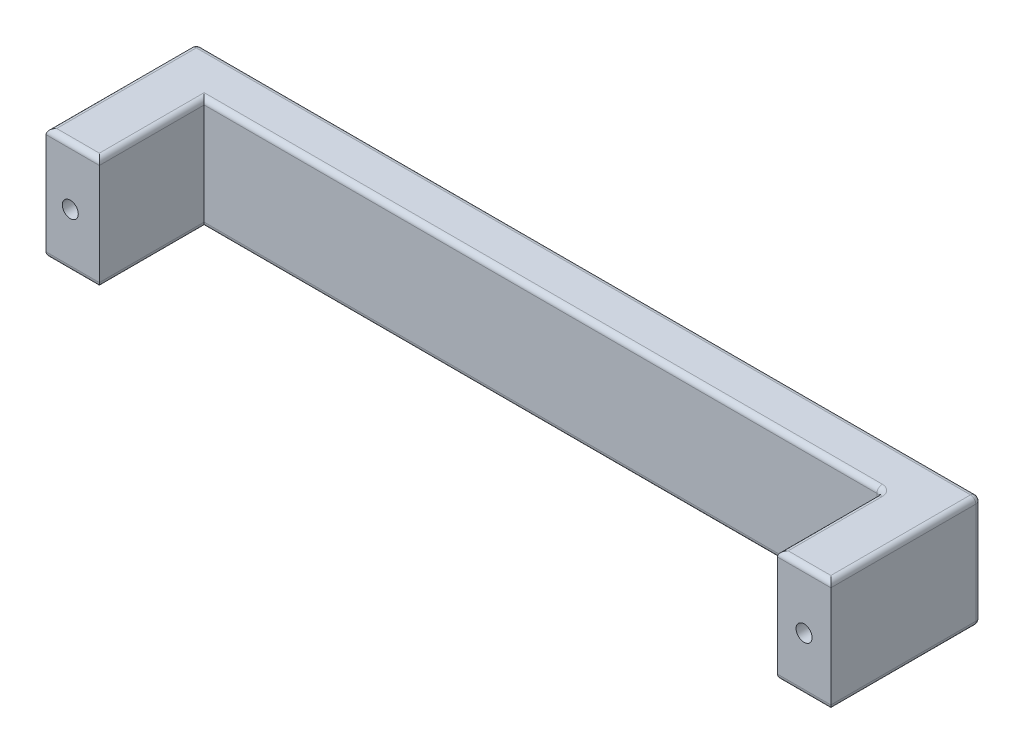
ISO-10303-21;
HEADER;
FILE_DESCRIPTION(('STEP AP214'),'2;1');
FILE_NAME('part.step','',(''),(''),'','','');
FILE_SCHEMA(('AUTOMOTIVE_DESIGN { 1 0 10303 214 1 1 1 1 }'));
ENDSEC;
DATA;
#1=APPLICATION_CONTEXT('core data for automotive mechanical design processes');
#2=APPLICATION_PROTOCOL_DEFINITION('international standard','automotive_design',2000,#1);
#3=PRODUCT_CONTEXT('',#1,'mechanical');
#4=PRODUCT('Part','Part','',(#3));
#5=PRODUCT_RELATED_PRODUCT_CATEGORY('part','',(#4));
#6=PRODUCT_DEFINITION_FORMATION('','',#4);
#7=PRODUCT_DEFINITION_CONTEXT('part definition',#1,'design');
#8=PRODUCT_DEFINITION('design','',#6,#7);
#9=PRODUCT_DEFINITION_SHAPE('','',#8);
#10=(LENGTH_UNIT() NAMED_UNIT(*) SI_UNIT(.MILLI.,.METRE.));
#11=(NAMED_UNIT(*) PLANE_ANGLE_UNIT() SI_UNIT($,.RADIAN.));
#12=(NAMED_UNIT(*) SI_UNIT($,.STERADIAN.) SOLID_ANGLE_UNIT());
#13=UNCERTAINTY_MEASURE_WITH_UNIT(LENGTH_MEASURE(1.E-05),#10,'distance_accuracy_value','');
#14=(GEOMETRIC_REPRESENTATION_CONTEXT(3) GLOBAL_UNCERTAINTY_ASSIGNED_CONTEXT((#13)) GLOBAL_UNIT_ASSIGNED_CONTEXT((#10,
#11,#12)) REPRESENTATION_CONTEXT('',''));
#15=CARTESIAN_POINT('',(0.,0.,0.));
#16=DIRECTION('',(0.,0.,1.));
#17=DIRECTION('',(1.,0.,0.));
#18=AXIS2_PLACEMENT_3D('',#15,#16,#17);
#19=CARTESIAN_POINT('',(-35.5555555555556,21.,0.));
#20=DIRECTION('',(0.,0.,-1.));
#21=DIRECTION('',(-1.,0.,0.));
#22=AXIS2_PLACEMENT_3D('',#19,#20,#21);
#23=PLANE('',#22);
#24=CARTESIAN_POINT('',(-41.007352784606,10.1448786083689,0.));
#25=DIRECTION('',(0.,0.,1.));
#26=DIRECTION('',(1.,0.,0.));
#27=AXIS2_PLACEMENT_3D('',#24,#25,#26);
#28=CIRCLE('',#27,1.5);
#29=CARTESIAN_POINT('',(-39.507352784606,10.1448786083689,0.));
#30=VERTEX_POINT('',#29);
#31=EDGE_CURVE('E184',#30,#30,#28,.T.);
#32=ORIENTED_EDGE('',*,*,#31,.F.);
#33=EDGE_LOOP('',(#32));
#34=FACE_BOUND('',#33,.T.);
#35=DIRECTION('',(0.,-1.,0.));
#36=VECTOR('',#35,1.);
#37=CARTESIAN_POINT('',(-45.5555555555555,21.,0.));
#38=LINE('',#37,#36);
#39=CARTESIAN_POINT('',(-45.5555555555555,20.,0.));
#40=VERTEX_POINT('',#39);
#41=CARTESIAN_POINT('',(-45.5555555555555,1.00000000000001,0.));
#42=VERTEX_POINT('',#41);
#43=EDGE_CURVE('E195',#40,#42,#38,.T.);
#44=ORIENTED_EDGE('',*,*,#43,.T.);
#45=DIRECTION('',(1.,0.,0.));
#46=VECTOR('',#45,1.);
#47=CARTESIAN_POINT('',(-35.5555555555556,1.,0.));
#48=LINE('',#47,#46);
#49=CARTESIAN_POINT('',(-35.5555555555556,1.00000000000001,0.));
#50=VERTEX_POINT('',#49);
#51=EDGE_CURVE('E271',#42,#50,#48,.T.);
#52=ORIENTED_EDGE('',*,*,#51,.T.);
#53=DIRECTION('',(0.,-1.,0.));
#54=VECTOR('',#53,1.);
#55=CARTESIAN_POINT('',(-35.5555555555556,21.,0.));
#56=LINE('',#55,#54);
#57=CARTESIAN_POINT('',(-35.5555555555556,20.,0.));
#58=VERTEX_POINT('',#57);
#59=EDGE_CURVE('E207',#58,#50,#56,.T.);
#60=ORIENTED_EDGE('',*,*,#59,.F.);
#61=DIRECTION('',(1.,0.,0.));
#62=VECTOR('',#61,1.);
#63=CARTESIAN_POINT('',(-35.5555555555556,20.,0.));
#64=LINE('',#63,#62);
#65=EDGE_CURVE('E269',#58,#40,#64,.F.);
#66=ORIENTED_EDGE('',*,*,#65,.T.);
#67=EDGE_LOOP('',(#44,#52,#60,#66));
#68=FACE_BOUND('',#67,.T.);
#69=ADVANCED_FACE('F34',(#34,#68),#23,.F.);
#70=CARTESIAN_POINT('',(-35.5555555555556,21.,-19.6296296296296));
#71=DIRECTION('',(-1.,0.,0.));
#72=DIRECTION('',(0.,0.,1.));
#73=AXIS2_PLACEMENT_3D('',#70,#71,#72);
#74=PLANE('',#73);
#75=ORIENTED_EDGE('',*,*,#59,.T.);
#76=DIRECTION('',(0.,0.,-1.));
#77=VECTOR('',#76,1.);
#78=CARTESIAN_POINT('',(-35.5555555555556,1.,-19.6296296296296));
#79=LINE('',#78,#77);
#80=CARTESIAN_POINT('',(-35.5555555555556,1.00000000000001,-19.6296296296296));
#81=VERTEX_POINT('',#80);
#82=EDGE_CURVE('E275',#50,#81,#79,.T.);
#83=ORIENTED_EDGE('',*,*,#82,.T.);
#84=DIRECTION('',(0.,-1.,0.));
#85=VECTOR('',#84,1.);
#86=CARTESIAN_POINT('',(-35.5555555555556,21.,-19.6296296296296));
#87=LINE('',#86,#85);
#88=CARTESIAN_POINT('',(-35.5555555555556,20.,-19.6296296296296));
#89=VERTEX_POINT('',#88);
#90=EDGE_CURVE('E204',#89,#81,#87,.T.);
#91=ORIENTED_EDGE('',*,*,#90,.F.);
#92=DIRECTION('',(0.,0.,-1.));
#93=VECTOR('',#92,1.);
#94=CARTESIAN_POINT('',(-35.5555555555556,20.,-19.6296296296296));
#95=LINE('',#94,#93);
#96=EDGE_CURVE('E273',#89,#58,#95,.F.);
#97=ORIENTED_EDGE('',*,*,#96,.T.);
#98=EDGE_LOOP('',(#75,#83,#91,#97));
#99=FACE_BOUND('',#98,.T.);
#100=ADVANCED_FACE('F431',(#99),#74,.F.);
#101=CARTESIAN_POINT('',(91.4814814814814,21.,-19.6296296296296));
#102=DIRECTION('',(0.,0.,-1.));
#103=DIRECTION('',(-1.,0.,0.));
#104=AXIS2_PLACEMENT_3D('',#101,#102,#103);
#105=PLANE('',#104);
#106=ORIENTED_EDGE('',*,*,#90,.T.);
#107=DIRECTION('',(1.,0.,0.));
#108=VECTOR('',#107,1.);
#109=CARTESIAN_POINT('',(91.4814814814814,1.,-19.6296296296296));
#110=LINE('',#109,#108);
#111=CARTESIAN_POINT('',(90.4814814814814,1.,-19.6296296296296));
#112=VERTEX_POINT('',#111);
#113=EDGE_CURVE('E263',#81,#112,#110,.T.);
#114=ORIENTED_EDGE('',*,*,#113,.T.);
#115=DIRECTION('',(0.,-1.,0.));
#116=VECTOR('',#115,1.);
#117=CARTESIAN_POINT('',(90.4814814814814,21.,-19.6296296296296));
#118=LINE('',#117,#116);
#119=CARTESIAN_POINT('',(90.4814814814814,20.,-19.6296296296296));
#120=VERTEX_POINT('',#119);
#121=EDGE_CURVE('E261',#112,#120,#118,.F.);
#122=ORIENTED_EDGE('',*,*,#121,.T.);
#123=DIRECTION('',(1.,0.,0.));
#124=VECTOR('',#123,1.);
#125=CARTESIAN_POINT('',(91.4814814814814,20.,-19.6296296296296));
#126=LINE('',#125,#124);
#127=EDGE_CURVE('E259',#120,#89,#126,.F.);
#128=ORIENTED_EDGE('',*,*,#127,.T.);
#129=EDGE_LOOP('',(#106,#114,#122,#128));
#130=FACE_BOUND('',#129,.T.);
#131=ADVANCED_FACE('F442',(#130),#105,.F.);
#132=CARTESIAN_POINT('',(91.4814814814814,21.,0.));
#133=DIRECTION('',(1.,0.,0.));
#134=DIRECTION('',(0.,0.,-1.));
#135=AXIS2_PLACEMENT_3D('',#132,#133,#134);
#136=PLANE('',#135);
#137=DIRECTION('',(0.,-1.,0.));
#138=VECTOR('',#137,1.);
#139=CARTESIAN_POINT('',(91.4814814814814,0.,-18.6296296296296));
#140=LINE('',#139,#138);
#141=CARTESIAN_POINT('',(91.4814814814814,20.,-18.6296296296296));
#142=VERTEX_POINT('',#141);
#143=CARTESIAN_POINT('',(91.4814814814814,1.,-18.6296296296296));
#144=VERTEX_POINT('',#143);
#145=EDGE_CURVE('E255',#142,#144,#140,.T.);
#146=ORIENTED_EDGE('',*,*,#145,.T.);
#147=DIRECTION('',(0.,0.,1.));
#148=VECTOR('',#147,1.);
#149=CARTESIAN_POINT('',(91.4814814814814,1.,0.));
#150=LINE('',#149,#148);
#151=CARTESIAN_POINT('',(91.4814814814814,1.00000000000001,0.));
#152=VERTEX_POINT('',#151);
#153=EDGE_CURVE('E257',#144,#152,#150,.T.);
#154=ORIENTED_EDGE('',*,*,#153,.T.);
#155=DIRECTION('',(0.,-1.,0.));
#156=VECTOR('',#155,1.);
#157=CARTESIAN_POINT('',(91.4814814814814,21.,0.));
#158=LINE('',#157,#156);
#159=CARTESIAN_POINT('',(91.4814814814814,20.,0.));
#160=VERTEX_POINT('',#159);
#161=EDGE_CURVE('E201',#160,#152,#158,.T.);
#162=ORIENTED_EDGE('',*,*,#161,.F.);
#163=DIRECTION('',(0.,0.,1.));
#164=VECTOR('',#163,1.);
#165=CARTESIAN_POINT('',(91.4814814814814,20.,0.));
#166=LINE('',#165,#164);
#167=EDGE_CURVE('E253',#160,#142,#166,.F.);
#168=ORIENTED_EDGE('',*,*,#167,.T.);
#169=EDGE_LOOP('',(#146,#154,#162,#168));
#170=FACE_BOUND('',#169,.T.);
#171=ADVANCED_FACE('F456',(#170),#136,.F.);
#172=CARTESIAN_POINT('',(101.481481481481,21.,0.));
#173=DIRECTION('',(0.,0.,-1.));
#174=DIRECTION('',(-1.,0.,0.));
#175=AXIS2_PLACEMENT_3D('',#172,#173,#174);
#176=PLANE('',#175);
#177=CARTESIAN_POINT('',(96.462672376075,10.1448786083689,0.));
#178=DIRECTION('',(0.,0.,1.));
#179=DIRECTION('',(1.,0.,0.));
#180=AXIS2_PLACEMENT_3D('',#177,#178,#179);
#181=CIRCLE('',#180,1.5);
#182=CARTESIAN_POINT('',(97.962672376075,10.1448786083689,0.));
#183=VERTEX_POINT('',#182);
#184=EDGE_CURVE('E183',#183,#183,#181,.T.);
#185=ORIENTED_EDGE('',*,*,#184,.F.);
#186=EDGE_LOOP('',(#185));
#187=FACE_BOUND('',#186,.T.);
#188=ORIENTED_EDGE('',*,*,#161,.T.);
#189=DIRECTION('',(1.,0.,0.));
#190=VECTOR('',#189,1.);
#191=CARTESIAN_POINT('',(101.481481481481,1.,0.));
#192=LINE('',#191,#190);
#193=CARTESIAN_POINT('',(101.481481481481,1.00000000000001,0.));
#194=VERTEX_POINT('',#193);
#195=EDGE_CURVE('E267',#152,#194,#192,.T.);
#196=ORIENTED_EDGE('',*,*,#195,.T.);
#197=DIRECTION('',(0.,-1.,0.));
#198=VECTOR('',#197,1.);
#199=CARTESIAN_POINT('',(101.481481481481,21.,0.));
#200=LINE('',#199,#198);
#201=CARTESIAN_POINT('',(101.481481481481,20.,0.));
#202=VERTEX_POINT('',#201);
#203=EDGE_CURVE('E198',#202,#194,#200,.T.);
#204=ORIENTED_EDGE('',*,*,#203,.F.);
#205=DIRECTION('',(1.,0.,0.));
#206=VECTOR('',#205,1.);
#207=CARTESIAN_POINT('',(101.481481481481,20.,0.));
#208=LINE('',#207,#206);
#209=EDGE_CURVE('E265',#202,#160,#208,.F.);
#210=ORIENTED_EDGE('',*,*,#209,.T.);
#211=EDGE_LOOP('',(#188,#196,#204,#210));
#212=FACE_BOUND('',#211,.T.);
#213=ADVANCED_FACE('F459',(#187,#212),#176,.F.);
#214=CARTESIAN_POINT('',(101.481481481481,21.,-28.1481481481481));
#215=DIRECTION('',(-1.,0.,0.));
#216=DIRECTION('',(0.,0.,1.));
#217=AXIS2_PLACEMENT_3D('',#214,#215,#216);
#218=PLANE('',#217);
#219=ORIENTED_EDGE('',*,*,#203,.T.);
#220=DIRECTION('',(0.,0.,-1.));
#221=VECTOR('',#220,1.);
#222=CARTESIAN_POINT('',(101.481481481481,1.,-28.1481481481481));
#223=LINE('',#222,#221);
#224=CARTESIAN_POINT('',(101.481481481481,1.,-27.1481481481481));
#225=VERTEX_POINT('',#224);
#226=EDGE_CURVE('E244',#194,#225,#223,.T.);
#227=ORIENTED_EDGE('',*,*,#226,.T.);
#228=DIRECTION('',(0.,-1.,0.));
#229=VECTOR('',#228,1.);
#230=CARTESIAN_POINT('',(101.481481481481,21.,-27.1481481481481));
#231=LINE('',#230,#229);
#232=CARTESIAN_POINT('',(101.481481481481,20.,-27.1481481481481));
#233=VERTEX_POINT('',#232);
#234=EDGE_CURVE('E241',#225,#233,#231,.F.);
#235=ORIENTED_EDGE('',*,*,#234,.T.);
#236=DIRECTION('',(0.,0.,-1.));
#237=VECTOR('',#236,1.);
#238=CARTESIAN_POINT('',(101.481481481481,20.,-28.1481481481481));
#239=LINE('',#238,#237);
#240=EDGE_CURVE('E239',#233,#202,#239,.F.);
#241=ORIENTED_EDGE('',*,*,#240,.T.);
#242=EDGE_LOOP('',(#219,#227,#235,#241));
#243=FACE_BOUND('',#242,.T.);
#244=ADVANCED_FACE('F577',(#243),#218,.F.);
#245=CARTESIAN_POINT('',(-45.5555555555555,21.,-28.1481481481481));
#246=DIRECTION('',(0.,0.,1.));
#247=DIRECTION('',(1.,0.,0.));
#248=AXIS2_PLACEMENT_3D('',#245,#246,#247);
#249=PLANE('',#248);
#250=DIRECTION('',(0.,-1.,0.));
#251=VECTOR('',#250,1.);
#252=CARTESIAN_POINT('',(100.481481481481,21.,-28.1481481481481));
#253=LINE('',#252,#251);
#254=CARTESIAN_POINT('',(100.481481481481,20.,-28.1481481481481));
#255=VERTEX_POINT('',#254);
#256=CARTESIAN_POINT('',(100.481481481481,1.,-28.1481481481481));
#257=VERTEX_POINT('',#256);
#258=EDGE_CURVE('E214',#255,#257,#253,.T.);
#259=ORIENTED_EDGE('',*,*,#258,.T.);
#260=DIRECTION('',(-1.,0.,0.));
#261=VECTOR('',#260,1.);
#262=CARTESIAN_POINT('',(-45.5555555555555,1.,-28.1481481481481));
#263=LINE('',#262,#261);
#264=CARTESIAN_POINT('',(-44.5555555555555,1.,-28.1481481481481));
#265=VERTEX_POINT('',#264);
#266=EDGE_CURVE('E216',#257,#265,#263,.T.);
#267=ORIENTED_EDGE('',*,*,#266,.T.);
#268=DIRECTION('',(0.,-1.,0.));
#269=VECTOR('',#268,1.);
#270=CARTESIAN_POINT('',(-44.5555555555555,21.,-28.1481481481481));
#271=LINE('',#270,#269);
#272=CARTESIAN_POINT('',(-44.5555555555555,20.,-28.1481481481481));
#273=VERTEX_POINT('',#272);
#274=EDGE_CURVE('E212',#265,#273,#271,.F.);
#275=ORIENTED_EDGE('',*,*,#274,.T.);
#276=DIRECTION('',(-1.,0.,0.));
#277=VECTOR('',#276,1.);
#278=CARTESIAN_POINT('',(-45.5555555555555,20.,-28.1481481481481));
#279=LINE('',#278,#277);
#280=EDGE_CURVE('E210',#273,#255,#279,.F.);
#281=ORIENTED_EDGE('',*,*,#280,.T.);
#282=EDGE_LOOP('',(#259,#267,#275,#281));
#283=FACE_BOUND('',#282,.T.);
#284=ADVANCED_FACE('F574',(#283),#249,.F.);
#285=CARTESIAN_POINT('',(-45.5555555555555,21.,0.));
#286=DIRECTION('',(1.,0.,0.));
#287=DIRECTION('',(0.,0.,-1.));
#288=AXIS2_PLACEMENT_3D('',#285,#286,#287);
#289=PLANE('',#288);
#290=DIRECTION('',(0.,-1.,0.));
#291=VECTOR('',#290,1.);
#292=CARTESIAN_POINT('',(-45.5555555555555,21.,-27.1481481481481));
#293=LINE('',#292,#291);
#294=CARTESIAN_POINT('',(-45.5555555555555,20.,-27.1481481481481));
#295=VERTEX_POINT('',#294);
#296=CARTESIAN_POINT('',(-45.5555555555555,1.,-27.1481481481481));
#297=VERTEX_POINT('',#296);
#298=EDGE_CURVE('E248',#295,#297,#293,.T.);
#299=ORIENTED_EDGE('',*,*,#298,.T.);
#300=DIRECTION('',(0.,0.,1.));
#301=VECTOR('',#300,1.);
#302=CARTESIAN_POINT('',(-45.5555555555555,1.,0.));
#303=LINE('',#302,#301);
#304=EDGE_CURVE('E250',#297,#42,#303,.T.);
#305=ORIENTED_EDGE('',*,*,#304,.T.);
#306=ORIENTED_EDGE('',*,*,#43,.F.);
#307=DIRECTION('',(0.,0.,1.));
#308=VECTOR('',#307,1.);
#309=CARTESIAN_POINT('',(-45.5555555555555,20.,0.));
#310=LINE('',#309,#308);
#311=EDGE_CURVE('E246',#40,#295,#310,.F.);
#312=ORIENTED_EDGE('',*,*,#311,.T.);
#313=EDGE_LOOP('',(#299,#305,#306,#312));
#314=FACE_BOUND('',#313,.T.);
#315=ADVANCED_FACE('F398',(#314),#289,.F.);
#316=CARTESIAN_POINT('',(0.,21.,0.));
#317=DIRECTION('',(0.,-1.,0.));
#318=DIRECTION('',(0.,0.,-1.));
#319=AXIS2_PLACEMENT_3D('',#316,#317,#318);
#320=PLANE('',#319);
#321=DIRECTION('',(0.,0.,1.));
#322=VECTOR('',#321,1.);
#323=CARTESIAN_POINT('',(92.4814814814814,21.,0.));
#324=LINE('',#323,#322);
#325=CARTESIAN_POINT('',(92.4814814814814,21.,-18.6296296296296));
#326=VERTEX_POINT('',#325);
#327=CARTESIAN_POINT('',(92.4814814814814,21.,-1.));
#328=VERTEX_POINT('',#327);
#329=EDGE_CURVE('E282',#326,#328,#324,.T.);
#330=ORIENTED_EDGE('',*,*,#329,.T.);
#331=DIRECTION('',(1.,0.,0.));
#332=VECTOR('',#331,1.);
#333=CARTESIAN_POINT('',(0.,21.,-1.));
#334=LINE('',#333,#332);
#335=CARTESIAN_POINT('',(100.481481481481,21.,-1.));
#336=VERTEX_POINT('',#335);
#337=EDGE_CURVE('E11',#328,#336,#334,.T.);
#338=ORIENTED_EDGE('',*,*,#337,.T.);
#339=DIRECTION('',(0.,0.,-1.));
#340=VECTOR('',#339,1.);
#341=CARTESIAN_POINT('',(100.481481481481,21.,0.));
#342=LINE('',#341,#340);
#343=CARTESIAN_POINT('',(100.481481481481,21.,-27.1481481481481));
#344=VERTEX_POINT('',#343);
#345=EDGE_CURVE('E43',#336,#344,#342,.T.);
#346=ORIENTED_EDGE('',*,*,#345,.T.);
#347=DIRECTION('',(-1.,0.,0.));
#348=VECTOR('',#347,1.);
#349=CARTESIAN_POINT('',(0.,21.,-27.1481481481481));
#350=LINE('',#349,#348);
#351=CARTESIAN_POINT('',(-44.5555555555555,21.,-27.1481481481481));
#352=VERTEX_POINT('',#351);
#353=EDGE_CURVE('E291',#344,#352,#350,.T.);
#354=ORIENTED_EDGE('',*,*,#353,.T.);
#355=DIRECTION('',(0.,0.,1.));
#356=VECTOR('',#355,1.);
#357=CARTESIAN_POINT('',(-44.5555555555555,21.,0.));
#358=LINE('',#357,#356);
#359=CARTESIAN_POINT('',(-44.5555555555555,21.,-1.));
#360=VERTEX_POINT('',#359);
#361=EDGE_CURVE('E289',#352,#360,#358,.T.);
#362=ORIENTED_EDGE('',*,*,#361,.T.);
#363=DIRECTION('',(1.,0.,0.));
#364=VECTOR('',#363,1.);
#365=CARTESIAN_POINT('',(0.,21.,-1.));
#366=LINE('',#365,#364);
#367=CARTESIAN_POINT('',(-36.5555555555556,21.,-1.));
#368=VERTEX_POINT('',#367);
#369=EDGE_CURVE('E287',#360,#368,#366,.T.);
#370=ORIENTED_EDGE('',*,*,#369,.T.);
#371=DIRECTION('',(0.,0.,-1.));
#372=VECTOR('',#371,1.);
#373=CARTESIAN_POINT('',(-36.5555555555556,21.,0.));
#374=LINE('',#373,#372);
#375=CARTESIAN_POINT('',(-36.5555555555556,21.,-20.6296296296296));
#376=VERTEX_POINT('',#375);
#377=EDGE_CURVE('E284',#368,#376,#374,.T.);
#378=ORIENTED_EDGE('',*,*,#377,.T.);
#379=DIRECTION('',(1.,0.,0.));
#380=VECTOR('',#379,1.);
#381=CARTESIAN_POINT('',(0.,21.,-20.6296296296296));
#382=LINE('',#381,#380);
#383=CARTESIAN_POINT('',(90.4814814814814,21.,-20.6296296296296));
#384=VERTEX_POINT('',#383);
#385=EDGE_CURVE('E280',#376,#384,#382,.T.);
#386=ORIENTED_EDGE('',*,*,#385,.T.);
#387=CARTESIAN_POINT('',(90.4814814814814,21.,-18.6296296296296));
#388=DIRECTION('',(0.,-1.,0.));
#389=DIRECTION('',(0.,0.,-1.));
#390=AXIS2_PLACEMENT_3D('',#387,#388,#389);
#391=CIRCLE('',#390,2.);
#392=EDGE_CURVE('E277',#326,#384,#391,.F.);
#393=ORIENTED_EDGE('',*,*,#392,.F.);
#394=EDGE_LOOP('',(#330,#338,#346,#354,#362,#370,#378,#386,#393));
#395=FACE_BOUND('',#394,.T.);
#396=ADVANCED_FACE('F381',(#395),#320,.F.);
#397=CARTESIAN_POINT('',(0.,0.,0.));
#398=DIRECTION('',(0.,-1.,0.));
#399=DIRECTION('',(0.,0.,-1.));
#400=AXIS2_PLACEMENT_3D('',#397,#398,#399);
#401=PLANE('',#400);
#402=DIRECTION('',(0.,0.,-1.));
#403=VECTOR('',#402,1.);
#404=CARTESIAN_POINT('',(100.481481481481,0.,0.));
#405=LINE('',#404,#403);
#406=CARTESIAN_POINT('',(100.481481481481,0.,-27.1481481481481));
#407=VERTEX_POINT('',#406);
#408=CARTESIAN_POINT('',(100.481481481481,0.,-1.));
#409=VERTEX_POINT('',#408);
#410=EDGE_CURVE('E235',#407,#409,#405,.F.);
#411=ORIENTED_EDGE('',*,*,#410,.T.);
#412=DIRECTION('',(1.,0.,0.));
#413=VECTOR('',#412,1.);
#414=CARTESIAN_POINT('',(91.4814814814814,0.,-1.));
#415=LINE('',#414,#413);
#416=CARTESIAN_POINT('',(92.4814814814814,0.,-1.));
#417=VERTEX_POINT('',#416);
#418=EDGE_CURVE('E237',#409,#417,#415,.F.);
#419=ORIENTED_EDGE('',*,*,#418,.T.);
#420=DIRECTION('',(0.,0.,1.));
#421=VECTOR('',#420,1.);
#422=CARTESIAN_POINT('',(92.4814814814814,0.,-19.6296296296296));
#423=LINE('',#422,#421);
#424=CARTESIAN_POINT('',(92.4814814814814,0.,-18.6296296296296));
#425=VERTEX_POINT('',#424);
#426=EDGE_CURVE('E228',#417,#425,#423,.F.);
#427=ORIENTED_EDGE('',*,*,#426,.T.);
#428=CARTESIAN_POINT('',(90.4814814814814,0.,-18.6296296296296));
#429=DIRECTION('',(0.,-1.,0.));
#430=DIRECTION('',(0.,0.,-1.));
#431=AXIS2_PLACEMENT_3D('',#428,#429,#430);
#432=CIRCLE('',#431,2.);
#433=CARTESIAN_POINT('',(90.4814814814814,0.,-20.6296296296296));
#434=VERTEX_POINT('',#433);
#435=EDGE_CURVE('E225',#434,#425,#432,.T.);
#436=ORIENTED_EDGE('',*,*,#435,.F.);
#437=DIRECTION('',(1.,0.,0.));
#438=VECTOR('',#437,1.);
#439=CARTESIAN_POINT('',(-35.5555555555556,0.,-20.6296296296296));
#440=LINE('',#439,#438);
#441=CARTESIAN_POINT('',(-36.5555555555556,0.,-20.6296296296296));
#442=VERTEX_POINT('',#441);
#443=EDGE_CURVE('E223',#434,#442,#440,.F.);
#444=ORIENTED_EDGE('',*,*,#443,.T.);
#445=DIRECTION('',(0.,0.,-1.));
#446=VECTOR('',#445,1.);
#447=CARTESIAN_POINT('',(-36.5555555555556,0.,0.));
#448=LINE('',#447,#446);
#449=CARTESIAN_POINT('',(-36.5555555555556,0.,-1.));
#450=VERTEX_POINT('',#449);
#451=EDGE_CURVE('E219',#442,#450,#448,.F.);
#452=ORIENTED_EDGE('',*,*,#451,.T.);
#453=DIRECTION('',(1.,0.,0.));
#454=VECTOR('',#453,1.);
#455=CARTESIAN_POINT('',(-45.5555555555555,0.,-1.));
#456=LINE('',#455,#454);
#457=CARTESIAN_POINT('',(-44.5555555555555,0.,-1.));
#458=VERTEX_POINT('',#457);
#459=EDGE_CURVE('E221',#450,#458,#456,.F.);
#460=ORIENTED_EDGE('',*,*,#459,.T.);
#461=DIRECTION('',(0.,0.,1.));
#462=VECTOR('',#461,1.);
#463=CARTESIAN_POINT('',(-44.5555555555555,0.,-28.1481481481481));
#464=LINE('',#463,#462);
#465=CARTESIAN_POINT('',(-44.5555555555555,0.,-27.1481481481481));
#466=VERTEX_POINT('',#465);
#467=EDGE_CURVE('E230',#458,#466,#464,.F.);
#468=ORIENTED_EDGE('',*,*,#467,.T.);
#469=DIRECTION('',(-1.,0.,0.));
#470=VECTOR('',#469,1.);
#471=CARTESIAN_POINT('',(101.481481481481,0.,-27.1481481481481));
#472=LINE('',#471,#470);
#473=EDGE_CURVE('E232',#466,#407,#472,.F.);
#474=ORIENTED_EDGE('',*,*,#473,.T.);
#475=EDGE_LOOP('',(#411,#419,#427,#436,#444,#452,#460,#468,#474));
#476=FACE_BOUND('',#475,.T.);
#477=ADVANCED_FACE('F421',(#476),#401,.T.);
#478=CARTESIAN_POINT('',(90.4814814814814,20.,-18.6296296296296));
#479=DIRECTION('',(0.,-1.,0.));
#480=DIRECTION('',(0.,0.,-1.));
#481=AXIS2_PLACEMENT_3D('',#478,#479,#480);
#482=TOROIDAL_SURFACE('',#481,2.,1.);
#483=CARTESIAN_POINT('',(92.4814814814814,20.,-18.6296296296296));
#484=DIRECTION('',(0.,0.,-1.));
#485=DIRECTION('',(-1.,0.,0.));
#486=AXIS2_PLACEMENT_3D('',#483,#484,#485);
#487=CIRCLE('',#486,1.);
#488=EDGE_CURVE('E363',#326,#142,#487,.F.);
#489=ORIENTED_EDGE('',*,*,#488,.F.);
#490=ORIENTED_EDGE('',*,*,#392,.T.);
#491=CARTESIAN_POINT('',(90.4814814814814,20.,-20.6296296296296));
#492=DIRECTION('',(1.,0.,0.));
#493=DIRECTION('',(0.,0.,-1.));
#494=AXIS2_PLACEMENT_3D('',#491,#492,#493);
#495=CIRCLE('',#494,1.);
#496=EDGE_CURVE('E38',#120,#384,#495,.F.);
#497=ORIENTED_EDGE('',*,*,#496,.F.);
#498=CARTESIAN_POINT('',(90.4814814814814,20.,-18.6296296296296));
#499=DIRECTION('',(0.,-1.,0.));
#500=DIRECTION('',(0.,0.,-1.));
#501=AXIS2_PLACEMENT_3D('',#498,#499,#500);
#502=CIRCLE('',#501,1.);
#503=EDGE_CURVE('E365',#142,#120,#502,.F.);
#504=ORIENTED_EDGE('',*,*,#503,.F.);
#505=EDGE_LOOP('',(#489,#490,#497,#504));
#506=FACE_BOUND('',#505,.T.);
#507=ADVANCED_FACE('F36',(#506),#482,.T.);
#508=CARTESIAN_POINT('',(0.,20.,-20.6296296296296));
#509=DIRECTION('',(1.,0.,0.));
#510=DIRECTION('',(0.,0.,-1.));
#511=AXIS2_PLACEMENT_3D('',#508,#509,#510);
#512=CYLINDRICAL_SURFACE('',#511,1.);
#513=ORIENTED_EDGE('',*,*,#496,.T.);
#514=ORIENTED_EDGE('',*,*,#385,.F.);
#515=CARTESIAN_POINT('',(-36.5555555555556,20.,-20.6296296296296));
#516=DIRECTION('',(0.707106781186547,0.,-0.707106781186547));
#517=DIRECTION('',(-0.707106781186547,0.,-0.707106781186547));
#518=AXIS2_PLACEMENT_3D('',#515,#516,#517);
#519=ELLIPSE('',#518,1.41421356237309,1.);
#520=EDGE_CURVE('E361',#89,#376,#519,.F.);
#521=ORIENTED_EDGE('',*,*,#520,.F.);
#522=ORIENTED_EDGE('',*,*,#127,.F.);
#523=EDGE_LOOP('',(#513,#514,#521,#522));
#524=FACE_BOUND('',#523,.T.);
#525=ADVANCED_FACE('F376',(#524),#512,.T.);
#526=CARTESIAN_POINT('',(90.4814814814814,21.,-18.6296296296296));
#527=DIRECTION('',(0.,1.,0.));
#528=DIRECTION('',(0.,0.,1.));
#529=AXIS2_PLACEMENT_3D('',#526,#527,#528);
#530=CYLINDRICAL_SURFACE('',#529,1.);
#531=ORIENTED_EDGE('',*,*,#503,.T.);
#532=ORIENTED_EDGE('',*,*,#121,.F.);
#533=CARTESIAN_POINT('',(90.4814814814814,1.,-18.6296296296296));
#534=DIRECTION('',(0.,-1.,0.));
#535=DIRECTION('',(0.,0.,-1.));
#536=AXIS2_PLACEMENT_3D('',#533,#534,#535);
#537=CIRCLE('',#536,1.);
#538=EDGE_CURVE('E358',#144,#112,#537,.F.);
#539=ORIENTED_EDGE('',*,*,#538,.F.);
#540=ORIENTED_EDGE('',*,*,#145,.F.);
#541=EDGE_LOOP('',(#531,#532,#539,#540));
#542=FACE_BOUND('',#541,.T.);
#543=ADVANCED_FACE('F444',(#542),#530,.F.);
#544=CARTESIAN_POINT('',(92.4814814814814,20.,0.));
#545=DIRECTION('',(0.,0.,1.));
#546=DIRECTION('',(1.,0.,0.));
#547=AXIS2_PLACEMENT_3D('',#544,#545,#546);
#548=CYLINDRICAL_SURFACE('',#547,1.);
#549=ORIENTED_EDGE('',*,*,#488,.T.);
#550=ORIENTED_EDGE('',*,*,#167,.F.);
#551=CARTESIAN_POINT('',(92.4814814814814,20.,-1.));
#552=DIRECTION('',(0.707106781186547,0.,0.707106781186547));
#553=DIRECTION('',(0.707106781186547,0.,-0.707106781186547));
#554=AXIS2_PLACEMENT_3D('',#551,#552,#553);
#555=ELLIPSE('',#554,1.41421356237309,1.);
#556=EDGE_CURVE('E355',#328,#160,#555,.T.);
#557=ORIENTED_EDGE('',*,*,#556,.F.);
#558=ORIENTED_EDGE('',*,*,#329,.F.);
#559=EDGE_LOOP('',(#549,#550,#557,#558));
#560=FACE_BOUND('',#559,.T.);
#561=ADVANCED_FACE('F553',(#560),#548,.T.);
#562=CARTESIAN_POINT('',(-36.5555555555556,20.,0.));
#563=DIRECTION('',(0.,0.,-1.));
#564=DIRECTION('',(-1.,0.,0.));
#565=AXIS2_PLACEMENT_3D('',#562,#563,#564);
#566=CYLINDRICAL_SURFACE('',#565,1.);
#567=ORIENTED_EDGE('',*,*,#520,.T.);
#568=ORIENTED_EDGE('',*,*,#377,.F.);
#569=CARTESIAN_POINT('',(-36.5555555555556,20.,-1.));
#570=DIRECTION('',(0.707106781186547,0.,-0.707106781186547));
#571=DIRECTION('',(0.707106781186547,0.,0.707106781186547));
#572=AXIS2_PLACEMENT_3D('',#569,#570,#571);
#573=ELLIPSE('',#572,1.41421356237309,1.);
#574=EDGE_CURVE('E352',#58,#368,#573,.F.);
#575=ORIENTED_EDGE('',*,*,#574,.F.);
#576=ORIENTED_EDGE('',*,*,#96,.F.);
#577=EDGE_LOOP('',(#567,#568,#575,#576));
#578=FACE_BOUND('',#577,.T.);
#579=ADVANCED_FACE('F387',(#578),#566,.T.);
#580=CARTESIAN_POINT('',(90.4814814814814,1.,-18.6296296296296));
#581=DIRECTION('',(0.,-1.,0.));
#582=DIRECTION('',(0.,0.,-1.));
#583=AXIS2_PLACEMENT_3D('',#580,#581,#582);
#584=TOROIDAL_SURFACE('',#583,2.,1.);
#585=CARTESIAN_POINT('',(92.4814814814814,1.,-18.6296296296296));
#586=DIRECTION('',(0.,0.,-1.));
#587=DIRECTION('',(-1.,0.,0.));
#588=AXIS2_PLACEMENT_3D('',#585,#586,#587);
#589=CIRCLE('',#588,1.);
#590=EDGE_CURVE('E346',#144,#425,#589,.F.);
#591=ORIENTED_EDGE('',*,*,#590,.F.);
#592=ORIENTED_EDGE('',*,*,#538,.T.);
#593=CARTESIAN_POINT('',(90.4814814814814,1.,-20.6296296296296));
#594=DIRECTION('',(1.,0.,0.));
#595=DIRECTION('',(0.,0.,-1.));
#596=AXIS2_PLACEMENT_3D('',#593,#594,#595);
#597=CIRCLE('',#596,1.);
#598=EDGE_CURVE('E349',#434,#112,#597,.F.);
#599=ORIENTED_EDGE('',*,*,#598,.F.);
#600=ORIENTED_EDGE('',*,*,#435,.T.);
#601=EDGE_LOOP('',(#591,#592,#599,#600));
#602=FACE_BOUND('',#601,.T.);
#603=ADVANCED_FACE('F447',(#602),#584,.T.);
#604=CARTESIAN_POINT('',(0.,20.,-1.));
#605=DIRECTION('',(1.,0.,0.));
#606=DIRECTION('',(0.,0.,-1.));
#607=AXIS2_PLACEMENT_3D('',#604,#605,#606);
#608=CYLINDRICAL_SURFACE('',#607,1.);
#609=ORIENTED_EDGE('',*,*,#556,.T.);
#610=ORIENTED_EDGE('',*,*,#209,.F.);
#611=CARTESIAN_POINT('',(100.481481481481,20.,-1.));
#612=DIRECTION('',(0.707106781186547,0.,-0.707106781186547));
#613=DIRECTION('',(-0.707106781186547,0.,-0.707106781186547));
#614=AXIS2_PLACEMENT_3D('',#611,#612,#613);
#615=ELLIPSE('',#614,1.41421356237309,1.);
#616=EDGE_CURVE('E343',#336,#202,#615,.T.);
#617=ORIENTED_EDGE('',*,*,#616,.F.);
#618=ORIENTED_EDGE('',*,*,#337,.F.);
#619=EDGE_LOOP('',(#609,#610,#617,#618));
#620=FACE_BOUND('',#619,.T.);
#621=ADVANCED_FACE('F463',(#620),#608,.T.);
#622=CARTESIAN_POINT('',(0.,20.,-1.));
#623=DIRECTION('',(1.,0.,0.));
#624=DIRECTION('',(0.,0.,-1.));
#625=AXIS2_PLACEMENT_3D('',#622,#623,#624);
#626=CYLINDRICAL_SURFACE('',#625,1.);
#627=ORIENTED_EDGE('',*,*,#574,.T.);
#628=ORIENTED_EDGE('',*,*,#369,.F.);
#629=CARTESIAN_POINT('',(-44.5555555555555,20.,-1.));
#630=DIRECTION('',(0.707106781186547,0.,0.707106781186547));
#631=DIRECTION('',(0.707106781186547,0.,-0.707106781186547));
#632=AXIS2_PLACEMENT_3D('',#629,#630,#631);
#633=ELLIPSE('',#632,1.41421356237309,1.);
#634=EDGE_CURVE('E340',#40,#360,#633,.F.);
#635=ORIENTED_EDGE('',*,*,#634,.F.);
#636=ORIENTED_EDGE('',*,*,#65,.F.);
#637=EDGE_LOOP('',(#627,#628,#635,#636));
#638=FACE_BOUND('',#637,.T.);
#639=ADVANCED_FACE('F391',(#638),#626,.T.);
#640=CARTESIAN_POINT('',(91.4814814814814,1.,-20.6296296296296));
#641=DIRECTION('',(-1.,0.,0.));
#642=DIRECTION('',(0.,0.,1.));
#643=AXIS2_PLACEMENT_3D('',#640,#641,#642);
#644=CYLINDRICAL_SURFACE('',#643,1.);
#645=ORIENTED_EDGE('',*,*,#598,.T.);
#646=ORIENTED_EDGE('',*,*,#113,.F.);
#647=CARTESIAN_POINT('',(-36.5555555555556,1.,-20.6296296296296));
#648=DIRECTION('',(-0.707106781186547,0.,0.707106781186547));
#649=DIRECTION('',(-0.707106781186547,0.,-0.707106781186547));
#650=AXIS2_PLACEMENT_3D('',#647,#648,#649);
#651=ELLIPSE('',#650,1.41421356237309,1.);
#652=EDGE_CURVE('E337',#442,#81,#651,.T.);
#653=ORIENTED_EDGE('',*,*,#652,.F.);
#654=ORIENTED_EDGE('',*,*,#443,.F.);
#655=EDGE_LOOP('',(#645,#646,#653,#654));
#656=FACE_BOUND('',#655,.T.);
#657=ADVANCED_FACE('F439',(#656),#644,.T.);
#658=CARTESIAN_POINT('',(92.4814814814814,1.,0.));
#659=DIRECTION('',(0.,0.,-1.));
#660=DIRECTION('',(-1.,0.,0.));
#661=AXIS2_PLACEMENT_3D('',#658,#659,#660);
#662=CYLINDRICAL_SURFACE('',#661,1.);
#663=ORIENTED_EDGE('',*,*,#590,.T.);
#664=ORIENTED_EDGE('',*,*,#426,.F.);
#665=CARTESIAN_POINT('',(92.4814814814814,1.,-1.));
#666=DIRECTION('',(-0.707106781186547,0.,-0.707106781186547));
#667=DIRECTION('',(-0.707106781186547,0.,0.707106781186547));
#668=AXIS2_PLACEMENT_3D('',#665,#666,#667);
#669=ELLIPSE('',#668,1.41421356237309,1.);
#670=EDGE_CURVE('E334',#152,#417,#669,.F.);
#671=ORIENTED_EDGE('',*,*,#670,.F.);
#672=ORIENTED_EDGE('',*,*,#153,.F.);
#673=EDGE_LOOP('',(#663,#664,#671,#672));
#674=FACE_BOUND('',#673,.T.);
#675=ADVANCED_FACE('F452',(#674),#662,.T.);
#676=CARTESIAN_POINT('',(100.481481481481,20.,0.));
#677=DIRECTION('',(0.,0.,-1.));
#678=DIRECTION('',(-1.,0.,0.));
#679=AXIS2_PLACEMENT_3D('',#676,#677,#678);
#680=CYLINDRICAL_SURFACE('',#679,1.);
#681=ORIENTED_EDGE('',*,*,#616,.T.);
#682=ORIENTED_EDGE('',*,*,#240,.F.);
#683=CARTESIAN_POINT('',(100.481481481481,20.,-27.1481481481481));
#684=DIRECTION('',(0.,0.,-1.));
#685=DIRECTION('',(-1.,0.,0.));
#686=AXIS2_PLACEMENT_3D('',#683,#684,#685);
#687=CIRCLE('',#686,1.);
#688=EDGE_CURVE('E331',#344,#233,#687,.T.);
#689=ORIENTED_EDGE('',*,*,#688,.F.);
#690=ORIENTED_EDGE('',*,*,#345,.F.);
#691=EDGE_LOOP('',(#681,#682,#689,#690));
#692=FACE_BOUND('',#691,.T.);
#693=ADVANCED_FACE('F466',(#692),#680,.T.);
#694=CARTESIAN_POINT('',(0.,20.,-27.1481481481481));
#695=DIRECTION('',(-1.,0.,0.));
#696=DIRECTION('',(0.,0.,1.));
#697=AXIS2_PLACEMENT_3D('',#694,#695,#696);
#698=CYLINDRICAL_SURFACE('',#697,1.);
#699=CARTESIAN_POINT('',(-44.5555555555555,20.,-27.1481481481481));
#700=DIRECTION('',(-1.,0.,0.));
#701=DIRECTION('',(0.,0.,1.));
#702=AXIS2_PLACEMENT_3D('',#699,#700,#701);
#703=CIRCLE('',#702,1.);
#704=EDGE_CURVE('E325',#352,#273,#703,.T.);
#705=ORIENTED_EDGE('',*,*,#704,.F.);
#706=ORIENTED_EDGE('',*,*,#353,.F.);
#707=CARTESIAN_POINT('',(100.481481481481,20.,-27.1481481481481));
#708=DIRECTION('',(1.,0.,0.));
#709=DIRECTION('',(0.,0.,-1.));
#710=AXIS2_PLACEMENT_3D('',#707,#708,#709);
#711=CIRCLE('',#710,1.);
#712=EDGE_CURVE('E328',#255,#344,#711,.T.);
#713=ORIENTED_EDGE('',*,*,#712,.F.);
#714=ORIENTED_EDGE('',*,*,#280,.F.);
#715=EDGE_LOOP('',(#705,#706,#713,#714));
#716=FACE_BOUND('',#715,.T.);
#717=ADVANCED_FACE('F476',(#716),#698,.T.);
#718=CARTESIAN_POINT('',(-44.5555555555555,20.,0.));
#719=DIRECTION('',(0.,0.,1.));
#720=DIRECTION('',(1.,0.,0.));
#721=AXIS2_PLACEMENT_3D('',#718,#719,#720);
#722=CYLINDRICAL_SURFACE('',#721,1.);
#723=ORIENTED_EDGE('',*,*,#634,.T.);
#724=ORIENTED_EDGE('',*,*,#361,.F.);
#725=CARTESIAN_POINT('',(-44.5555555555555,20.,-27.1481481481481));
#726=DIRECTION('',(0.,0.,-1.));
#727=DIRECTION('',(-1.,0.,0.));
#728=AXIS2_PLACEMENT_3D('',#725,#726,#727);
#729=CIRCLE('',#728,1.);
#730=EDGE_CURVE('E322',#295,#352,#729,.T.);
#731=ORIENTED_EDGE('',*,*,#730,.F.);
#732=ORIENTED_EDGE('',*,*,#311,.F.);
#733=EDGE_LOOP('',(#723,#724,#731,#732));
#734=FACE_BOUND('',#733,.T.);
#735=ADVANCED_FACE('F479',(#734),#722,.T.);
#736=CARTESIAN_POINT('',(-36.5555555555556,1.,-19.6296296296296));
#737=DIRECTION('',(0.,0.,1.));
#738=DIRECTION('',(1.,0.,0.));
#739=AXIS2_PLACEMENT_3D('',#736,#737,#738);
#740=CYLINDRICAL_SURFACE('',#739,1.);
#741=ORIENTED_EDGE('',*,*,#652,.T.);
#742=ORIENTED_EDGE('',*,*,#82,.F.);
#743=CARTESIAN_POINT('',(-36.5555555555556,1.,-1.));
#744=DIRECTION('',(-0.707106781186547,0.,0.707106781186547));
#745=DIRECTION('',(0.707106781186547,0.,0.707106781186547));
#746=AXIS2_PLACEMENT_3D('',#743,#744,#745);
#747=ELLIPSE('',#746,1.41421356237309,1.);
#748=EDGE_CURVE('E319',#450,#50,#747,.T.);
#749=ORIENTED_EDGE('',*,*,#748,.F.);
#750=ORIENTED_EDGE('',*,*,#451,.F.);
#751=EDGE_LOOP('',(#741,#742,#749,#750));
#752=FACE_BOUND('',#751,.T.);
#753=ADVANCED_FACE('F434',(#752),#740,.T.);
#754=CARTESIAN_POINT('',(101.481481481481,1.,-1.));
#755=DIRECTION('',(-1.,0.,0.));
#756=DIRECTION('',(0.,0.,1.));
#757=AXIS2_PLACEMENT_3D('',#754,#755,#756);
#758=CYLINDRICAL_SURFACE('',#757,1.);
#759=ORIENTED_EDGE('',*,*,#670,.T.);
#760=ORIENTED_EDGE('',*,*,#418,.F.);
#761=CARTESIAN_POINT('',(100.481481481481,1.,-1.));
#762=DIRECTION('',(-0.707106781186547,0.,0.707106781186547));
#763=DIRECTION('',(0.707106781186547,0.,0.707106781186547));
#764=AXIS2_PLACEMENT_3D('',#761,#762,#763);
#765=ELLIPSE('',#764,1.41421356237309,1.);
#766=EDGE_CURVE('E316',#194,#409,#765,.F.);
#767=ORIENTED_EDGE('',*,*,#766,.F.);
#768=ORIENTED_EDGE('',*,*,#195,.F.);
#769=EDGE_LOOP('',(#759,#760,#767,#768));
#770=FACE_BOUND('',#769,.T.);
#771=ADVANCED_FACE('F491',(#770),#758,.T.);
#772=CARTESIAN_POINT('',(100.481481481481,20.,-27.1481481481481));
#773=DIRECTION('',(0.,0.,1.));
#774=DIRECTION('',(1.,0.,0.));
#775=AXIS2_PLACEMENT_3D('',#772,#773,#774);
#776=SPHERICAL_SURFACE('',#775,1.);
#777=ORIENTED_EDGE('',*,*,#712,.T.);
#778=ORIENTED_EDGE('',*,*,#688,.T.);
#779=CARTESIAN_POINT('',(100.481481481481,20.,-27.1481481481481));
#780=DIRECTION('',(0.,1.,0.));
#781=DIRECTION('',(0.,0.,1.));
#782=AXIS2_PLACEMENT_3D('',#779,#780,#781);
#783=CIRCLE('',#782,1.);
#784=EDGE_CURVE('E314',#255,#233,#783,.F.);
#785=ORIENTED_EDGE('',*,*,#784,.F.);
#786=EDGE_LOOP('',(#777,#778,#785));
#787=FACE_BOUND('',#786,.T.);
#788=ADVANCED_FACE('F471',(#787),#776,.T.);
#789=CARTESIAN_POINT('',(-44.5555555555555,20.,-27.1481481481481));
#790=DIRECTION('',(0.,0.,1.));
#791=DIRECTION('',(1.,0.,0.));
#792=AXIS2_PLACEMENT_3D('',#789,#790,#791);
#793=SPHERICAL_SURFACE('',#792,1.);
#794=ORIENTED_EDGE('',*,*,#730,.T.);
#795=ORIENTED_EDGE('',*,*,#704,.T.);
#796=CARTESIAN_POINT('',(-44.5555555555555,20.,-27.1481481481481));
#797=DIRECTION('',(0.,1.,0.));
#798=DIRECTION('',(0.,0.,1.));
#799=AXIS2_PLACEMENT_3D('',#796,#797,#798);
#800=CIRCLE('',#799,1.);
#801=EDGE_CURVE('E311',#295,#273,#800,.F.);
#802=ORIENTED_EDGE('',*,*,#801,.F.);
#803=EDGE_LOOP('',(#794,#795,#802));
#804=FACE_BOUND('',#803,.T.);
#805=ADVANCED_FACE('F482',(#804),#793,.T.);
#806=CARTESIAN_POINT('',(-35.5555555555556,1.,-1.));
#807=DIRECTION('',(-1.,0.,0.));
#808=DIRECTION('',(0.,0.,1.));
#809=AXIS2_PLACEMENT_3D('',#806,#807,#808);
#810=CYLINDRICAL_SURFACE('',#809,1.);
#811=ORIENTED_EDGE('',*,*,#748,.T.);
#812=ORIENTED_EDGE('',*,*,#51,.F.);
#813=CARTESIAN_POINT('',(-44.5555555555555,1.,-1.));
#814=DIRECTION('',(-0.707106781186547,0.,-0.707106781186547));
#815=DIRECTION('',(-0.707106781186547,0.,0.707106781186547));
#816=AXIS2_PLACEMENT_3D('',#813,#814,#815);
#817=ELLIPSE('',#816,1.41421356237309,1.);
#818=EDGE_CURVE('E309',#458,#42,#817,.T.);
#819=ORIENTED_EDGE('',*,*,#818,.F.);
#820=ORIENTED_EDGE('',*,*,#459,.F.);
#821=EDGE_LOOP('',(#811,#812,#819,#820));
#822=FACE_BOUND('',#821,.T.);
#823=ADVANCED_FACE('F428',(#822),#810,.T.);
#824=CARTESIAN_POINT('',(100.481481481481,1.,-28.1481481481481));
#825=DIRECTION('',(0.,0.,1.));
#826=DIRECTION('',(1.,0.,0.));
#827=AXIS2_PLACEMENT_3D('',#824,#825,#826);
#828=CYLINDRICAL_SURFACE('',#827,1.);
#829=ORIENTED_EDGE('',*,*,#766,.T.);
#830=ORIENTED_EDGE('',*,*,#410,.F.);
#831=CARTESIAN_POINT('',(100.481481481481,1.,-27.1481481481481));
#832=DIRECTION('',(0.,0.,-1.));
#833=DIRECTION('',(-1.,0.,0.));
#834=AXIS2_PLACEMENT_3D('',#831,#832,#833);
#835=CIRCLE('',#834,1.);
#836=EDGE_CURVE('E306',#225,#407,#835,.T.);
#837=ORIENTED_EDGE('',*,*,#836,.F.);
#838=ORIENTED_EDGE('',*,*,#226,.F.);
#839=EDGE_LOOP('',(#829,#830,#837,#838));
#840=FACE_BOUND('',#839,.T.);
#841=ADVANCED_FACE('F489',(#840),#828,.T.);
#842=CARTESIAN_POINT('',(100.481481481481,21.,-27.1481481481481));
#843=DIRECTION('',(0.,-1.,0.));
#844=DIRECTION('',(0.,0.,-1.));
#845=AXIS2_PLACEMENT_3D('',#842,#843,#844);
#846=CYLINDRICAL_SURFACE('',#845,1.);
#847=ORIENTED_EDGE('',*,*,#784,.T.);
#848=ORIENTED_EDGE('',*,*,#234,.F.);
#849=CARTESIAN_POINT('',(100.481481481481,1.,-27.1481481481481));
#850=DIRECTION('',(0.,-1.,0.));
#851=DIRECTION('',(0.,0.,-1.));
#852=AXIS2_PLACEMENT_3D('',#849,#850,#851);
#853=CIRCLE('',#852,1.);
#854=EDGE_CURVE('E303',#257,#225,#853,.T.);
#855=ORIENTED_EDGE('',*,*,#854,.F.);
#856=ORIENTED_EDGE('',*,*,#258,.F.);
#857=EDGE_LOOP('',(#847,#848,#855,#856));
#858=FACE_BOUND('',#857,.T.);
#859=ADVANCED_FACE('F516',(#858),#846,.T.);
#860=CARTESIAN_POINT('',(-44.5555555555555,21.,-27.1481481481481));
#861=DIRECTION('',(0.,-1.,0.));
#862=DIRECTION('',(0.,0.,-1.));
#863=AXIS2_PLACEMENT_3D('',#860,#861,#862);
#864=CYLINDRICAL_SURFACE('',#863,1.);
#865=ORIENTED_EDGE('',*,*,#801,.T.);
#866=ORIENTED_EDGE('',*,*,#274,.F.);
#867=CARTESIAN_POINT('',(-44.5555555555555,1.,-27.1481481481481));
#868=DIRECTION('',(0.,-1.,0.));
#869=DIRECTION('',(0.,0.,-1.));
#870=AXIS2_PLACEMENT_3D('',#867,#868,#869);
#871=CIRCLE('',#870,1.);
#872=EDGE_CURVE('E300',#297,#265,#871,.T.);
#873=ORIENTED_EDGE('',*,*,#872,.F.);
#874=ORIENTED_EDGE('',*,*,#298,.F.);
#875=EDGE_LOOP('',(#865,#866,#873,#874));
#876=FACE_BOUND('',#875,.T.);
#877=ADVANCED_FACE('F412',(#876),#864,.T.);
#878=CARTESIAN_POINT('',(-44.5555555555555,1.,0.));
#879=DIRECTION('',(0.,0.,-1.));
#880=DIRECTION('',(-1.,0.,0.));
#881=AXIS2_PLACEMENT_3D('',#878,#879,#880);
#882=CYLINDRICAL_SURFACE('',#881,1.);
#883=ORIENTED_EDGE('',*,*,#818,.T.);
#884=ORIENTED_EDGE('',*,*,#304,.F.);
#885=CARTESIAN_POINT('',(-44.5555555555555,1.,-27.1481481481481));
#886=DIRECTION('',(0.,0.,-1.));
#887=DIRECTION('',(-1.,0.,0.));
#888=AXIS2_PLACEMENT_3D('',#885,#886,#887);
#889=CIRCLE('',#888,1.);
#890=EDGE_CURVE('E297',#466,#297,#889,.T.);
#891=ORIENTED_EDGE('',*,*,#890,.F.);
#892=ORIENTED_EDGE('',*,*,#467,.F.);
#893=EDGE_LOOP('',(#883,#884,#891,#892));
#894=FACE_BOUND('',#893,.T.);
#895=ADVANCED_FACE('F405',(#894),#882,.T.);
#896=CARTESIAN_POINT('',(100.481481481481,1.,-27.1481481481481));
#897=DIRECTION('',(0.,0.,1.));
#898=DIRECTION('',(1.,0.,0.));
#899=AXIS2_PLACEMENT_3D('',#896,#897,#898);
#900=SPHERICAL_SURFACE('',#899,1.);
#901=ORIENTED_EDGE('',*,*,#854,.T.);
#902=ORIENTED_EDGE('',*,*,#836,.T.);
#903=CARTESIAN_POINT('',(100.481481481481,1.,-27.1481481481481));
#904=DIRECTION('',(1.,0.,0.));
#905=DIRECTION('',(0.,0.,-1.));
#906=AXIS2_PLACEMENT_3D('',#903,#904,#905);
#907=CIRCLE('',#906,1.);
#908=EDGE_CURVE('E295',#257,#407,#907,.F.);
#909=ORIENTED_EDGE('',*,*,#908,.F.);
#910=EDGE_LOOP('',(#901,#902,#909));
#911=FACE_BOUND('',#910,.T.);
#912=ADVANCED_FACE('F508',(#911),#900,.T.);
#913=CARTESIAN_POINT('',(-44.5555555555555,1.,-27.1481481481481));
#914=DIRECTION('',(0.,0.,1.));
#915=DIRECTION('',(1.,0.,0.));
#916=AXIS2_PLACEMENT_3D('',#913,#914,#915);
#917=SPHERICAL_SURFACE('',#916,1.);
#918=ORIENTED_EDGE('',*,*,#890,.T.);
#919=ORIENTED_EDGE('',*,*,#872,.T.);
#920=CARTESIAN_POINT('',(-44.5555555555555,1.,-27.1481481481481));
#921=DIRECTION('',(-1.,0.,0.));
#922=DIRECTION('',(0.,0.,1.));
#923=AXIS2_PLACEMENT_3D('',#920,#921,#922);
#924=CIRCLE('',#923,1.);
#925=EDGE_CURVE('E194',#466,#265,#924,.F.);
#926=ORIENTED_EDGE('',*,*,#925,.F.);
#927=EDGE_LOOP('',(#918,#919,#926));
#928=FACE_BOUND('',#927,.T.);
#929=ADVANCED_FACE('F415',(#928),#917,.T.);
#930=CARTESIAN_POINT('',(-45.5555555555555,1.,-27.1481481481481));
#931=DIRECTION('',(1.,0.,0.));
#932=DIRECTION('',(0.,0.,-1.));
#933=AXIS2_PLACEMENT_3D('',#930,#931,#932);
#934=CYLINDRICAL_SURFACE('',#933,1.);
#935=ORIENTED_EDGE('',*,*,#908,.T.);
#936=ORIENTED_EDGE('',*,*,#473,.F.);
#937=ORIENTED_EDGE('',*,*,#925,.T.);
#938=ORIENTED_EDGE('',*,*,#266,.F.);
#939=EDGE_LOOP('',(#935,#936,#937,#938));
#940=FACE_BOUND('',#939,.T.);
#941=ADVANCED_FACE('F418',(#940),#934,.T.);
#942=CARTESIAN_POINT('',(96.462672376075,10.1448786083689,-15.));
#943=DIRECTION('',(0.,0.,1.));
#944=DIRECTION('',(1.,0.,0.));
#945=AXIS2_PLACEMENT_3D('',#942,#943,#944);
#946=CONICAL_SURFACE('',#945,1.5,1.02974425867666);
#947=CARTESIAN_POINT('',(96.462672376075,10.1448786083689,-15.9012909285413));
#948=VERTEX_POINT('',#947);
#949=VERTEX_LOOP('',#948);
#950=FACE_BOUND('',#949,.T.);
#951=CARTESIAN_POINT('',(96.462672376075,10.1448786083689,-15.));
#952=DIRECTION('',(0.,0.,1.));
#953=DIRECTION('',(1.,0.,0.));
#954=AXIS2_PLACEMENT_3D('',#951,#952,#953);
#955=CIRCLE('',#954,1.5);
#956=CARTESIAN_POINT('',(97.962672376075,10.1448786083689,-15.));
#957=VERTEX_POINT('',#956);
#958=EDGE_CURVE('E187',#957,#957,#955,.T.);
#959=ORIENTED_EDGE('',*,*,#958,.T.);
#960=EDGE_LOOP('',(#959));
#961=FACE_BOUND('',#960,.T.);
#962=ADVANCED_FACE('F505',(#950,#961),#946,.F.);
#963=CARTESIAN_POINT('',(96.462672376075,10.1448786083689,0.));
#964=DIRECTION('',(0.,0.,1.));
#965=DIRECTION('',(1.,0.,0.));
#966=AXIS2_PLACEMENT_3D('',#963,#964,#965);
#967=CYLINDRICAL_SURFACE('',#966,1.5);
#968=ORIENTED_EDGE('',*,*,#958,.F.);
#969=EDGE_LOOP('',(#968));
#970=FACE_BOUND('',#969,.T.);
#971=ORIENTED_EDGE('',*,*,#184,.T.);
#972=EDGE_LOOP('',(#971));
#973=FACE_BOUND('',#972,.T.);
#974=ADVANCED_FACE('F177',(#970,#973),#967,.F.);
#975=CARTESIAN_POINT('',(-41.007352784606,10.1448786083689,-15.));
#976=DIRECTION('',(0.,0.,1.));
#977=DIRECTION('',(1.,0.,0.));
#978=AXIS2_PLACEMENT_3D('',#975,#976,#977);
#979=CONICAL_SURFACE('',#978,1.49999999999999,1.02974425867665);
#980=CARTESIAN_POINT('',(-41.007352784606,10.1448786083689,-15.9012909285413));
#981=VERTEX_POINT('',#980);
#982=VERTEX_LOOP('',#981);
#983=FACE_BOUND('',#982,.T.);
#984=CARTESIAN_POINT('',(-41.007352784606,10.1448786083689,-15.));
#985=DIRECTION('',(0.,0.,1.));
#986=DIRECTION('',(1.,0.,0.));
#987=AXIS2_PLACEMENT_3D('',#984,#985,#986);
#988=CIRCLE('',#987,1.49999999999999);
#989=CARTESIAN_POINT('',(-39.507352784606,10.1448786083689,-15.));
#990=VERTEX_POINT('',#989);
#991=EDGE_CURVE('E181',#990,#990,#988,.T.);
#992=ORIENTED_EDGE('',*,*,#991,.T.);
#993=EDGE_LOOP('',(#992));
#994=FACE_BOUND('',#993,.T.);
#995=ADVANCED_FACE('F173',(#983,#994),#979,.F.);
#996=CARTESIAN_POINT('',(-41.007352784606,10.1448786083689,0.));
#997=DIRECTION('',(0.,0.,1.));
#998=DIRECTION('',(1.,0.,0.));
#999=AXIS2_PLACEMENT_3D('',#996,#997,#998);
#1000=CYLINDRICAL_SURFACE('',#999,1.5);
#1001=ORIENTED_EDGE('',*,*,#991,.F.);
#1002=EDGE_LOOP('',(#1001));
#1003=FACE_BOUND('',#1002,.T.);
#1004=ORIENTED_EDGE('',*,*,#31,.T.);
#1005=EDGE_LOOP('',(#1004));
#1006=FACE_BOUND('',#1005,.T.);
#1007=ADVANCED_FACE('F176',(#1003,#1006),#1000,.F.);
#1008=CLOSED_SHELL('',(#69,#100,#131,#171,#213,#244,#284,#315,#396,#477,#507,#525,#543,#561,
#579,#603,#621,#639,#657,#675,#693,#717,#735,#753,#771,#788,#805,#823,#841,#859,#877,#895,#912,
#929,#941,#962,#974,#995,#1007));
#1009=MANIFOLD_SOLID_BREP('B2',#1008);
#1010=ADVANCED_BREP_SHAPE_REPRESENTATION('',(#18,#1009),#14);
#1011=SHAPE_DEFINITION_REPRESENTATION(#9,#1010);
ENDSEC;
END-ISO-10303-21;
